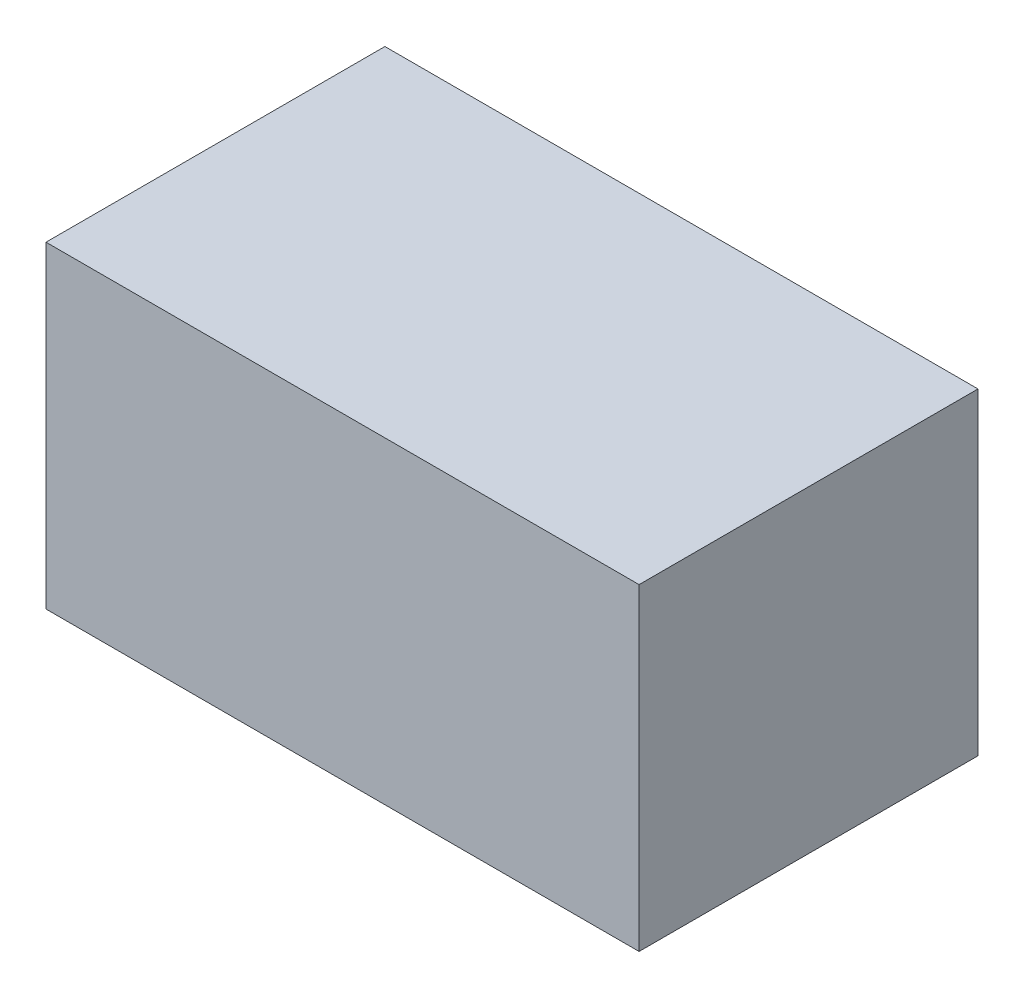
ISO-10303-21;
HEADER;
FILE_DESCRIPTION(('STEP AP214'),'2;1');
FILE_NAME('part.step','',(''),(''),'','','');
FILE_SCHEMA(('AUTOMOTIVE_DESIGN { 1 0 10303 214 1 1 1 1 }'));
ENDSEC;
DATA;
#1=APPLICATION_CONTEXT('core data for automotive mechanical design processes');
#2=APPLICATION_PROTOCOL_DEFINITION('international standard','automotive_design',2000,#1);
#3=PRODUCT_CONTEXT('',#1,'mechanical');
#4=PRODUCT('Part','Part','',(#3));
#5=PRODUCT_RELATED_PRODUCT_CATEGORY('part','',(#4));
#6=PRODUCT_DEFINITION_FORMATION('','',#4);
#7=PRODUCT_DEFINITION_CONTEXT('part definition',#1,'design');
#8=PRODUCT_DEFINITION('design','',#6,#7);
#9=PRODUCT_DEFINITION_SHAPE('','',#8);
#10=(LENGTH_UNIT() NAMED_UNIT(*) SI_UNIT(.MILLI.,.METRE.));
#11=(NAMED_UNIT(*) PLANE_ANGLE_UNIT() SI_UNIT($,.RADIAN.));
#12=(NAMED_UNIT(*) SI_UNIT($,.STERADIAN.) SOLID_ANGLE_UNIT());
#13=UNCERTAINTY_MEASURE_WITH_UNIT(LENGTH_MEASURE(1.E-05),#10,'distance_accuracy_value','');
#14=(GEOMETRIC_REPRESENTATION_CONTEXT(3) GLOBAL_UNCERTAINTY_ASSIGNED_CONTEXT((#13)) GLOBAL_UNIT_ASSIGNED_CONTEXT((#10,
#11,#12)) REPRESENTATION_CONTEXT('',''));
#15=CARTESIAN_POINT('',(0.,0.,0.));
#16=DIRECTION('',(0.,0.,1.));
#17=DIRECTION('',(1.,0.,0.));
#18=AXIS2_PLACEMENT_3D('',#15,#16,#17);
#19=CARTESIAN_POINT('',(70.,75.,40.));
#20=DIRECTION('',(-1.,0.,0.));
#21=DIRECTION('',(0.,0.,1.));
#22=AXIS2_PLACEMENT_3D('',#19,#20,#21);
#23=PLANE('',#22);
#24=DIRECTION('',(0.,0.,-1.));
#25=VECTOR('',#24,1.);
#26=CARTESIAN_POINT('',(70.,0.,40.));
#27=LINE('',#26,#25);
#28=CARTESIAN_POINT('',(70.,0.,40.));
#29=VERTEX_POINT('',#28);
#30=CARTESIAN_POINT('',(70.,0.,-40.));
#31=VERTEX_POINT('',#30);
#32=EDGE_CURVE('E112',#29,#31,#27,.T.);
#33=ORIENTED_EDGE('',*,*,#32,.T.);
#34=DIRECTION('',(0.,-1.,0.));
#35=VECTOR('',#34,1.);
#36=CARTESIAN_POINT('',(70.,75.,-40.));
#37=LINE('',#36,#35);
#38=CARTESIAN_POINT('',(70.,75.,-40.));
#39=VERTEX_POINT('',#38);
#40=EDGE_CURVE('E11',#39,#31,#37,.T.);
#41=ORIENTED_EDGE('',*,*,#40,.F.);
#42=DIRECTION('',(0.,0.,-1.));
#43=VECTOR('',#42,1.);
#44=CARTESIAN_POINT('',(70.,75.,40.));
#45=LINE('',#44,#43);
#46=CARTESIAN_POINT('',(70.,75.,40.));
#47=VERTEX_POINT('',#46);
#48=EDGE_CURVE('E95',#47,#39,#45,.T.);
#49=ORIENTED_EDGE('',*,*,#48,.F.);
#50=DIRECTION('',(0.,-1.,0.));
#51=VECTOR('',#50,1.);
#52=CARTESIAN_POINT('',(70.,75.,40.));
#53=LINE('',#52,#51);
#54=EDGE_CURVE('E108',#47,#29,#53,.T.);
#55=ORIENTED_EDGE('',*,*,#54,.T.);
#56=EDGE_LOOP('',(#33,#41,#49,#55));
#57=FACE_BOUND('',#56,.T.);
#58=ADVANCED_FACE('F40',(#57),#23,.F.);
#59=CARTESIAN_POINT('',(-70.,75.,-40.));
#60=DIRECTION('',(0.,0.,1.));
#61=DIRECTION('',(1.,0.,0.));
#62=AXIS2_PLACEMENT_3D('',#59,#60,#61);
#63=PLANE('',#62);
#64=DIRECTION('',(-1.,0.,0.));
#65=VECTOR('',#64,1.);
#66=CARTESIAN_POINT('',(-70.,0.,-40.));
#67=LINE('',#66,#65);
#68=CARTESIAN_POINT('',(-70.,0.,-40.));
#69=VERTEX_POINT('',#68);
#70=EDGE_CURVE('E100',#31,#69,#67,.T.);
#71=ORIENTED_EDGE('',*,*,#70,.T.);
#72=DIRECTION('',(0.,-1.,0.));
#73=VECTOR('',#72,1.);
#74=CARTESIAN_POINT('',(-70.,75.,-40.));
#75=LINE('',#74,#73);
#76=CARTESIAN_POINT('',(-70.,75.,-40.));
#77=VERTEX_POINT('',#76);
#78=EDGE_CURVE('E49',#77,#69,#75,.T.);
#79=ORIENTED_EDGE('',*,*,#78,.F.);
#80=DIRECTION('',(-1.,0.,0.));
#81=VECTOR('',#80,1.);
#82=CARTESIAN_POINT('',(-70.,75.,-40.));
#83=LINE('',#82,#81);
#84=EDGE_CURVE('E90',#39,#77,#83,.T.);
#85=ORIENTED_EDGE('',*,*,#84,.F.);
#86=ORIENTED_EDGE('',*,*,#40,.T.);
#87=EDGE_LOOP('',(#71,#79,#85,#86));
#88=FACE_BOUND('',#87,.T.);
#89=ADVANCED_FACE('F99',(#88),#63,.F.);
#90=CARTESIAN_POINT('',(-70.,75.,40.));
#91=DIRECTION('',(1.,0.,0.));
#92=DIRECTION('',(0.,0.,-1.));
#93=AXIS2_PLACEMENT_3D('',#90,#91,#92);
#94=PLANE('',#93);
#95=DIRECTION('',(0.,0.,1.));
#96=VECTOR('',#95,1.);
#97=CARTESIAN_POINT('',(-70.,0.,40.));
#98=LINE('',#97,#96);
#99=CARTESIAN_POINT('',(-70.,0.,40.));
#100=VERTEX_POINT('',#99);
#101=EDGE_CURVE('E77',#69,#100,#98,.T.);
#102=ORIENTED_EDGE('',*,*,#101,.T.);
#103=DIRECTION('',(0.,-1.,0.));
#104=VECTOR('',#103,1.);
#105=CARTESIAN_POINT('',(-70.,75.,40.));
#106=LINE('',#105,#104);
#107=CARTESIAN_POINT('',(-70.,75.,40.));
#108=VERTEX_POINT('',#107);
#109=EDGE_CURVE('E102',#108,#100,#106,.T.);
#110=ORIENTED_EDGE('',*,*,#109,.F.);
#111=DIRECTION('',(0.,0.,1.));
#112=VECTOR('',#111,1.);
#113=CARTESIAN_POINT('',(-70.,75.,40.));
#114=LINE('',#113,#112);
#115=EDGE_CURVE('E93',#77,#108,#114,.T.);
#116=ORIENTED_EDGE('',*,*,#115,.F.);
#117=ORIENTED_EDGE('',*,*,#78,.T.);
#118=EDGE_LOOP('',(#102,#110,#116,#117));
#119=FACE_BOUND('',#118,.T.);
#120=ADVANCED_FACE('F103',(#119),#94,.F.);
#121=CARTESIAN_POINT('',(-70.,75.,40.));
#122=DIRECTION('',(0.,0.,-1.));
#123=DIRECTION('',(-1.,0.,0.));
#124=AXIS2_PLACEMENT_3D('',#121,#122,#123);
#125=PLANE('',#124);
#126=DIRECTION('',(1.,0.,0.));
#127=VECTOR('',#126,1.);
#128=CARTESIAN_POINT('',(-70.,0.,40.));
#129=LINE('',#128,#127);
#130=EDGE_CURVE('E83',#100,#29,#129,.T.);
#131=ORIENTED_EDGE('',*,*,#130,.T.);
#132=ORIENTED_EDGE('',*,*,#54,.F.);
#133=DIRECTION('',(1.,0.,0.));
#134=VECTOR('',#133,1.);
#135=CARTESIAN_POINT('',(-70.,75.,40.));
#136=LINE('',#135,#134);
#137=EDGE_CURVE('E57',#108,#47,#136,.T.);
#138=ORIENTED_EDGE('',*,*,#137,.F.);
#139=ORIENTED_EDGE('',*,*,#109,.T.);
#140=EDGE_LOOP('',(#131,#132,#138,#139));
#141=FACE_BOUND('',#140,.T.);
#142=ADVANCED_FACE('F124',(#141),#125,.F.);
#143=CARTESIAN_POINT('',(0.,75.,0.));
#144=DIRECTION('',(0.,-1.,0.));
#145=DIRECTION('',(0.,0.,-1.));
#146=AXIS2_PLACEMENT_3D('',#143,#144,#145);
#147=PLANE('',#146);
#148=ORIENTED_EDGE('',*,*,#48,.T.);
#149=ORIENTED_EDGE('',*,*,#84,.T.);
#150=ORIENTED_EDGE('',*,*,#115,.T.);
#151=ORIENTED_EDGE('',*,*,#137,.T.);
#152=EDGE_LOOP('',(#148,#149,#150,#151));
#153=FACE_BOUND('',#152,.T.);
#154=ADVANCED_FACE('F91',(#153),#147,.F.);
#155=CARTESIAN_POINT('',(0.,0.,0.));
#156=DIRECTION('',(0.,-1.,0.));
#157=DIRECTION('',(0.,0.,-1.));
#158=AXIS2_PLACEMENT_3D('',#155,#156,#157);
#159=PLANE('',#158);
#160=ORIENTED_EDGE('',*,*,#32,.F.);
#161=ORIENTED_EDGE('',*,*,#130,.F.);
#162=ORIENTED_EDGE('',*,*,#101,.F.);
#163=ORIENTED_EDGE('',*,*,#70,.F.);
#164=EDGE_LOOP('',(#160,#161,#162,#163));
#165=FACE_BOUND('',#164,.T.);
#166=ADVANCED_FACE('F127',(#165),#159,.T.);
#167=CLOSED_SHELL('',(#58,#89,#120,#142,#154,#166));
#168=MANIFOLD_SOLID_BREP('B2',#167);
#169=ADVANCED_BREP_SHAPE_REPRESENTATION('',(#18,#168),#14);
#170=SHAPE_DEFINITION_REPRESENTATION(#9,#169);
ENDSEC;
END-ISO-10303-21;
